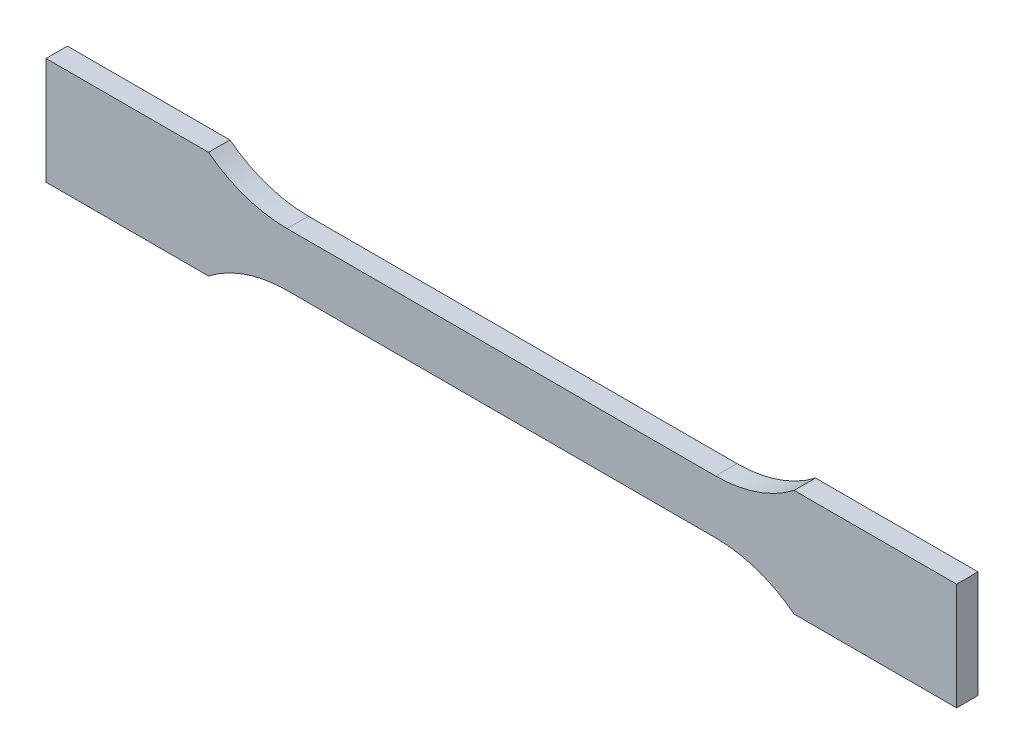
ISO-10303-21;
HEADER;
FILE_DESCRIPTION(('STEP AP214'),'2;1');
FILE_NAME('part.step','',(''),(''),'','','');
FILE_SCHEMA(('AUTOMOTIVE_DESIGN { 1 0 10303 214 1 1 1 1 }'));
ENDSEC;
DATA;
#1=APPLICATION_CONTEXT('core data for automotive mechanical design processes');
#2=APPLICATION_PROTOCOL_DEFINITION('international standard','automotive_design',2000,#1);
#3=PRODUCT_CONTEXT('',#1,'mechanical');
#4=PRODUCT('Part','Part','',(#3));
#5=PRODUCT_RELATED_PRODUCT_CATEGORY('part','',(#4));
#6=PRODUCT_DEFINITION_FORMATION('','',#4);
#7=PRODUCT_DEFINITION_CONTEXT('part definition',#1,'design');
#8=PRODUCT_DEFINITION('design','',#6,#7);
#9=PRODUCT_DEFINITION_SHAPE('','',#8);
#10=(LENGTH_UNIT() NAMED_UNIT(*) SI_UNIT(.MILLI.,.METRE.));
#11=(NAMED_UNIT(*) PLANE_ANGLE_UNIT() SI_UNIT($,.RADIAN.));
#12=(NAMED_UNIT(*) SI_UNIT($,.STERADIAN.) SOLID_ANGLE_UNIT());
#13=UNCERTAINTY_MEASURE_WITH_UNIT(LENGTH_MEASURE(1.E-05),#10,'distance_accuracy_value','');
#14=(GEOMETRIC_REPRESENTATION_CONTEXT(3) GLOBAL_UNCERTAINTY_ASSIGNED_CONTEXT((#13)) GLOBAL_UNIT_ASSIGNED_CONTEXT((#10,
#11,#12)) REPRESENTATION_CONTEXT('',''));
#15=CARTESIAN_POINT('',(0.,0.,0.));
#16=DIRECTION('',(0.,0.,1.));
#17=DIRECTION('',(1.,0.,0.));
#18=AXIS2_PLACEMENT_3D('',#15,#16,#17);
#19=CARTESIAN_POINT('',(-85.,9.99999999999999,2.));
#20=DIRECTION('',(0.,-1.,0.));
#21=DIRECTION('',(0.,0.,-1.));
#22=AXIS2_PLACEMENT_3D('',#19,#20,#21);
#23=PLANE('',#22);
#24=DIRECTION('',(-1.,0.,0.));
#25=VECTOR('',#24,1.);
#26=CARTESIAN_POINT('',(-85.,9.99999999999999,-2.));
#27=LINE('',#26,#25);
#28=CARTESIAN_POINT('',(-54.6628782986152,9.99999999999999,-2.));
#29=VERTEX_POINT('',#28);
#30=CARTESIAN_POINT('',(-85.,9.99999999999999,-2.));
#31=VERTEX_POINT('',#30);
#32=EDGE_CURVE('E155',#29,#31,#27,.T.);
#33=ORIENTED_EDGE('',*,*,#32,.T.);
#34=DIRECTION('',(0.,0.,-1.));
#35=VECTOR('',#34,1.);
#36=CARTESIAN_POINT('',(-85.,9.99999999999999,2.));
#37=LINE('',#36,#35);
#38=CARTESIAN_POINT('',(-85.,9.99999999999999,2.));
#39=VERTEX_POINT('',#38);
#40=EDGE_CURVE('E11',#39,#31,#37,.T.);
#41=ORIENTED_EDGE('',*,*,#40,.F.);
#42=DIRECTION('',(-1.,0.,0.));
#43=VECTOR('',#42,1.);
#44=CARTESIAN_POINT('',(-85.,9.99999999999999,2.));
#45=LINE('',#44,#43);
#46=CARTESIAN_POINT('',(-54.6628782986152,9.99999999999999,2.));
#47=VERTEX_POINT('',#46);
#48=EDGE_CURVE('E177',#47,#39,#45,.T.);
#49=ORIENTED_EDGE('',*,*,#48,.F.);
#50=DIRECTION('',(0.,0.,-1.));
#51=VECTOR('',#50,1.);
#52=CARTESIAN_POINT('',(-54.6628782986152,9.99999999999999,2.));
#53=LINE('',#52,#51);
#54=EDGE_CURVE('E151',#47,#29,#53,.T.);
#55=ORIENTED_EDGE('',*,*,#54,.T.);
#56=EDGE_LOOP('',(#33,#41,#49,#55));
#57=FACE_BOUND('',#56,.T.);
#58=ADVANCED_FACE('F35',(#57),#23,.F.);
#59=CARTESIAN_POINT('',(-85.,9.99999999999999,2.));
#60=DIRECTION('',(1.,0.,0.));
#61=DIRECTION('',(0.,0.,-1.));
#62=AXIS2_PLACEMENT_3D('',#59,#60,#61);
#63=PLANE('',#62);
#64=DIRECTION('',(0.,-1.,0.));
#65=VECTOR('',#64,1.);
#66=CARTESIAN_POINT('',(-85.,9.99999999999999,-2.));
#67=LINE('',#66,#65);
#68=CARTESIAN_POINT('',(-85.,-10.,-2.));
#69=VERTEX_POINT('',#68);
#70=EDGE_CURVE('E158',#31,#69,#67,.T.);
#71=ORIENTED_EDGE('',*,*,#70,.T.);
#72=DIRECTION('',(0.,0.,-1.));
#73=VECTOR('',#72,1.);
#74=CARTESIAN_POINT('',(-85.,-10.,2.));
#75=LINE('',#74,#73);
#76=CARTESIAN_POINT('',(-85.,-10.,2.));
#77=VERTEX_POINT('',#76);
#78=EDGE_CURVE('E43',#77,#69,#75,.T.);
#79=ORIENTED_EDGE('',*,*,#78,.F.);
#80=DIRECTION('',(0.,-1.,0.));
#81=VECTOR('',#80,1.);
#82=CARTESIAN_POINT('',(-85.,9.99999999999999,2.));
#83=LINE('',#82,#81);
#84=EDGE_CURVE('E106',#39,#77,#83,.T.);
#85=ORIENTED_EDGE('',*,*,#84,.F.);
#86=ORIENTED_EDGE('',*,*,#40,.T.);
#87=EDGE_LOOP('',(#71,#79,#85,#86));
#88=FACE_BOUND('',#87,.T.);
#89=ADVANCED_FACE('F255',(#88),#63,.F.);
#90=CARTESIAN_POINT('',(-85.,-10.,2.));
#91=DIRECTION('',(0.,1.,0.));
#92=DIRECTION('',(-1.,0.,0.));
#93=AXIS2_PLACEMENT_3D('',#90,#91,#92);
#94=PLANE('',#93);
#95=DIRECTION('',(1.,0.,0.));
#96=VECTOR('',#95,1.);
#97=CARTESIAN_POINT('',(-85.,-10.,-2.));
#98=LINE('',#97,#96);
#99=CARTESIAN_POINT('',(-54.6628782986152,-10.,-2.));
#100=VERTEX_POINT('',#99);
#101=EDGE_CURVE('E160',#69,#100,#98,.T.);
#102=ORIENTED_EDGE('',*,*,#101,.T.);
#103=DIRECTION('',(0.,0.,-1.));
#104=VECTOR('',#103,1.);
#105=CARTESIAN_POINT('',(-54.6628782986152,-10.,2.));
#106=LINE('',#105,#104);
#107=CARTESIAN_POINT('',(-54.6628782986152,-10.,2.));
#108=VERTEX_POINT('',#107);
#109=EDGE_CURVE('E196',#108,#100,#106,.T.);
#110=ORIENTED_EDGE('',*,*,#109,.F.);
#111=DIRECTION('',(1.,0.,0.));
#112=VECTOR('',#111,1.);
#113=CARTESIAN_POINT('',(-85.,-10.,2.));
#114=LINE('',#113,#112);
#115=EDGE_CURVE('E204',#77,#108,#114,.T.);
#116=ORIENTED_EDGE('',*,*,#115,.F.);
#117=ORIENTED_EDGE('',*,*,#78,.T.);
#118=EDGE_LOOP('',(#102,#110,#116,#117));
#119=FACE_BOUND('',#118,.T.);
#120=ADVANCED_FACE('F202',(#119),#94,.F.);
#121=CARTESIAN_POINT('',(-40.,-28.9999999999998,2.));
#122=DIRECTION('',(0.,0.,-1.));
#123=DIRECTION('',(-1.,0.,0.));
#124=AXIS2_PLACEMENT_3D('',#121,#122,#123);
#125=CYLINDRICAL_SURFACE('',#124,23.9999999999998);
#126=CARTESIAN_POINT('',(-40.,-28.9999999999998,-2.));
#127=DIRECTION('',(0.,0.,-1.));
#128=DIRECTION('',(1.,0.,0.));
#129=AXIS2_PLACEMENT_3D('',#126,#127,#128);
#130=CIRCLE('',#129,23.9999999999998);
#131=CARTESIAN_POINT('',(-40.,-4.99999999999999,-2.));
#132=VERTEX_POINT('',#131);
#133=EDGE_CURVE('E162',#100,#132,#130,.T.);
#134=ORIENTED_EDGE('',*,*,#133,.T.);
#135=DIRECTION('',(0.,0.,-1.));
#136=VECTOR('',#135,1.);
#137=CARTESIAN_POINT('',(-40.,-4.99999999999999,2.));
#138=LINE('',#137,#136);
#139=CARTESIAN_POINT('',(-40.,-4.99999999999999,2.));
#140=VERTEX_POINT('',#139);
#141=EDGE_CURVE('E193',#140,#132,#138,.T.);
#142=ORIENTED_EDGE('',*,*,#141,.F.);
#143=CARTESIAN_POINT('',(-40.,-28.9999999999998,2.));
#144=DIRECTION('',(0.,0.,-1.));
#145=DIRECTION('',(1.,0.,0.));
#146=AXIS2_PLACEMENT_3D('',#143,#144,#145);
#147=CIRCLE('',#146,23.9999999999998);
#148=EDGE_CURVE('E222',#108,#140,#147,.T.);
#149=ORIENTED_EDGE('',*,*,#148,.F.);
#150=ORIENTED_EDGE('',*,*,#109,.T.);
#151=EDGE_LOOP('',(#134,#142,#149,#150));
#152=FACE_BOUND('',#151,.T.);
#153=ADVANCED_FACE('F213',(#152),#125,.F.);
#154=CARTESIAN_POINT('',(-40.,-4.99999999999999,2.));
#155=DIRECTION('',(0.,1.,0.));
#156=DIRECTION('',(-1.,0.,0.));
#157=AXIS2_PLACEMENT_3D('',#154,#155,#156);
#158=PLANE('',#157);
#159=DIRECTION('',(1.,0.,0.));
#160=VECTOR('',#159,1.);
#161=CARTESIAN_POINT('',(-40.,-4.99999999999999,-2.));
#162=LINE('',#161,#160);
#163=CARTESIAN_POINT('',(40.,-4.99999999999999,-2.));
#164=VERTEX_POINT('',#163);
#165=EDGE_CURVE('E164',#132,#164,#162,.T.);
#166=ORIENTED_EDGE('',*,*,#165,.T.);
#167=DIRECTION('',(0.,0.,-1.));
#168=VECTOR('',#167,1.);
#169=CARTESIAN_POINT('',(40.,-4.99999999999999,2.));
#170=LINE('',#169,#168);
#171=CARTESIAN_POINT('',(40.,-4.99999999999999,2.));
#172=VERTEX_POINT('',#171);
#173=EDGE_CURVE('E190',#172,#164,#170,.T.);
#174=ORIENTED_EDGE('',*,*,#173,.F.);
#175=DIRECTION('',(1.,0.,0.));
#176=VECTOR('',#175,1.);
#177=CARTESIAN_POINT('',(-40.,-4.99999999999999,2.));
#178=LINE('',#177,#176);
#179=EDGE_CURVE('E219',#140,#172,#178,.T.);
#180=ORIENTED_EDGE('',*,*,#179,.F.);
#181=ORIENTED_EDGE('',*,*,#141,.T.);
#182=EDGE_LOOP('',(#166,#174,#180,#181));
#183=FACE_BOUND('',#182,.T.);
#184=ADVANCED_FACE('F217',(#183),#158,.F.);
#185=CARTESIAN_POINT('',(40.,-28.9999999999999,2.));
#186=DIRECTION('',(0.,0.,-1.));
#187=DIRECTION('',(-1.,0.,0.));
#188=AXIS2_PLACEMENT_3D('',#185,#186,#187);
#189=CYLINDRICAL_SURFACE('',#188,23.9999999999999);
#190=CARTESIAN_POINT('',(40.,-28.9999999999999,-2.));
#191=DIRECTION('',(0.,0.,-1.));
#192=DIRECTION('',(-1.,0.,0.));
#193=AXIS2_PLACEMENT_3D('',#190,#191,#192);
#194=CIRCLE('',#193,23.9999999999999);
#195=CARTESIAN_POINT('',(54.6628782986152,-10.,-2.));
#196=VERTEX_POINT('',#195);
#197=EDGE_CURVE('E166',#164,#196,#194,.T.);
#198=ORIENTED_EDGE('',*,*,#197,.T.);
#199=DIRECTION('',(0.,0.,-1.));
#200=VECTOR('',#199,1.);
#201=CARTESIAN_POINT('',(54.6628782986152,-10.,2.));
#202=LINE('',#201,#200);
#203=CARTESIAN_POINT('',(54.6628782986152,-10.,2.));
#204=VERTEX_POINT('',#203);
#205=EDGE_CURVE('E187',#204,#196,#202,.T.);
#206=ORIENTED_EDGE('',*,*,#205,.F.);
#207=CARTESIAN_POINT('',(40.,-28.9999999999999,2.));
#208=DIRECTION('',(0.,0.,-1.));
#209=DIRECTION('',(-1.,0.,0.));
#210=AXIS2_PLACEMENT_3D('',#207,#208,#209);
#211=CIRCLE('',#210,23.9999999999999);
#212=EDGE_CURVE('E221',#172,#204,#211,.T.);
#213=ORIENTED_EDGE('',*,*,#212,.F.);
#214=ORIENTED_EDGE('',*,*,#173,.T.);
#215=EDGE_LOOP('',(#198,#206,#213,#214));
#216=FACE_BOUND('',#215,.T.);
#217=ADVANCED_FACE('F268',(#216),#189,.F.);
#218=CARTESIAN_POINT('',(85.,-10.,2.));
#219=DIRECTION('',(0.,1.,0.));
#220=DIRECTION('',(-1.,0.,0.));
#221=AXIS2_PLACEMENT_3D('',#218,#219,#220);
#222=PLANE('',#221);
#223=DIRECTION('',(1.,0.,0.));
#224=VECTOR('',#223,1.);
#225=CARTESIAN_POINT('',(85.,-10.,-2.));
#226=LINE('',#225,#224);
#227=CARTESIAN_POINT('',(85.,-10.,-2.));
#228=VERTEX_POINT('',#227);
#229=EDGE_CURVE('E168',#196,#228,#226,.T.);
#230=ORIENTED_EDGE('',*,*,#229,.T.);
#231=DIRECTION('',(0.,0.,-1.));
#232=VECTOR('',#231,1.);
#233=CARTESIAN_POINT('',(85.,-10.,2.));
#234=LINE('',#233,#232);
#235=CARTESIAN_POINT('',(85.,-10.,2.));
#236=VERTEX_POINT('',#235);
#237=EDGE_CURVE('E184',#236,#228,#234,.T.);
#238=ORIENTED_EDGE('',*,*,#237,.F.);
#239=DIRECTION('',(1.,0.,0.));
#240=VECTOR('',#239,1.);
#241=CARTESIAN_POINT('',(85.,-10.,2.));
#242=LINE('',#241,#240);
#243=EDGE_CURVE('E224',#204,#236,#242,.T.);
#244=ORIENTED_EDGE('',*,*,#243,.F.);
#245=ORIENTED_EDGE('',*,*,#205,.T.);
#246=EDGE_LOOP('',(#230,#238,#244,#245));
#247=FACE_BOUND('',#246,.T.);
#248=ADVANCED_FACE('F271',(#247),#222,.F.);
#249=CARTESIAN_POINT('',(85.,9.99999999999999,2.));
#250=DIRECTION('',(-1.,0.,0.));
#251=DIRECTION('',(0.,-1.,0.));
#252=AXIS2_PLACEMENT_3D('',#249,#250,#251);
#253=PLANE('',#252);
#254=DIRECTION('',(0.,1.,0.));
#255=VECTOR('',#254,1.);
#256=CARTESIAN_POINT('',(85.,9.99999999999999,-2.));
#257=LINE('',#256,#255);
#258=CARTESIAN_POINT('',(85.,9.99999999999999,-2.));
#259=VERTEX_POINT('',#258);
#260=EDGE_CURVE('E170',#228,#259,#257,.T.);
#261=ORIENTED_EDGE('',*,*,#260,.T.);
#262=DIRECTION('',(0.,0.,-1.));
#263=VECTOR('',#262,1.);
#264=CARTESIAN_POINT('',(85.,9.99999999999999,2.));
#265=LINE('',#264,#263);
#266=CARTESIAN_POINT('',(85.,9.99999999999999,2.));
#267=VERTEX_POINT('',#266);
#268=EDGE_CURVE('E181',#267,#259,#265,.T.);
#269=ORIENTED_EDGE('',*,*,#268,.F.);
#270=DIRECTION('',(0.,1.,0.));
#271=VECTOR('',#270,1.);
#272=CARTESIAN_POINT('',(85.,9.99999999999999,2.));
#273=LINE('',#272,#271);
#274=EDGE_CURVE('E230',#236,#267,#273,.T.);
#275=ORIENTED_EDGE('',*,*,#274,.F.);
#276=ORIENTED_EDGE('',*,*,#237,.T.);
#277=EDGE_LOOP('',(#261,#269,#275,#276));
#278=FACE_BOUND('',#277,.T.);
#279=ADVANCED_FACE('F236',(#278),#253,.F.);
#280=CARTESIAN_POINT('',(54.6628782986152,9.99999999999999,2.));
#281=DIRECTION('',(0.,-1.,0.));
#282=DIRECTION('',(0.,0.,-1.));
#283=AXIS2_PLACEMENT_3D('',#280,#281,#282);
#284=PLANE('',#283);
#285=DIRECTION('',(-1.,0.,0.));
#286=VECTOR('',#285,1.);
#287=CARTESIAN_POINT('',(54.6628782986152,9.99999999999999,-2.));
#288=LINE('',#287,#286);
#289=CARTESIAN_POINT('',(54.6628782986152,9.99999999999999,-2.));
#290=VERTEX_POINT('',#289);
#291=EDGE_CURVE('E172',#259,#290,#288,.T.);
#292=ORIENTED_EDGE('',*,*,#291,.T.);
#293=DIRECTION('',(0.,0.,-1.));
#294=VECTOR('',#293,1.);
#295=CARTESIAN_POINT('',(54.6628782986152,9.99999999999999,2.));
#296=LINE('',#295,#294);
#297=CARTESIAN_POINT('',(54.6628782986152,9.99999999999999,2.));
#298=VERTEX_POINT('',#297);
#299=EDGE_CURVE('E146',#298,#290,#296,.T.);
#300=ORIENTED_EDGE('',*,*,#299,.F.);
#301=DIRECTION('',(-1.,0.,0.));
#302=VECTOR('',#301,1.);
#303=CARTESIAN_POINT('',(54.6628782986152,9.99999999999999,2.));
#304=LINE('',#303,#302);
#305=EDGE_CURVE('E137',#267,#298,#304,.T.);
#306=ORIENTED_EDGE('',*,*,#305,.F.);
#307=ORIENTED_EDGE('',*,*,#268,.T.);
#308=EDGE_LOOP('',(#292,#300,#306,#307));
#309=FACE_BOUND('',#308,.T.);
#310=ADVANCED_FACE('F240',(#309),#284,.F.);
#311=CARTESIAN_POINT('',(40.,29.,2.));
#312=DIRECTION('',(0.,0.,-1.));
#313=DIRECTION('',(-1.,0.,0.));
#314=AXIS2_PLACEMENT_3D('',#311,#312,#313);
#315=CYLINDRICAL_SURFACE('',#314,24.);
#316=CARTESIAN_POINT('',(40.,29.,-2.));
#317=DIRECTION('',(0.,0.,-1.));
#318=DIRECTION('',(1.,0.,0.));
#319=AXIS2_PLACEMENT_3D('',#316,#317,#318);
#320=CIRCLE('',#319,24.);
#321=CARTESIAN_POINT('',(40.,4.99999999999999,-2.));
#322=VERTEX_POINT('',#321);
#323=EDGE_CURVE('E145',#290,#322,#320,.T.);
#324=ORIENTED_EDGE('',*,*,#323,.T.);
#325=DIRECTION('',(0.,0.,-1.));
#326=VECTOR('',#325,1.);
#327=CARTESIAN_POINT('',(40.,4.99999999999999,2.));
#328=LINE('',#327,#326);
#329=CARTESIAN_POINT('',(40.,4.99999999999999,2.));
#330=VERTEX_POINT('',#329);
#331=EDGE_CURVE('E142',#330,#322,#328,.T.);
#332=ORIENTED_EDGE('',*,*,#331,.F.);
#333=CARTESIAN_POINT('',(40.,29.,2.));
#334=DIRECTION('',(0.,0.,-1.));
#335=DIRECTION('',(1.,0.,0.));
#336=AXIS2_PLACEMENT_3D('',#333,#334,#335);
#337=CIRCLE('',#336,24.);
#338=EDGE_CURVE('E131',#298,#330,#337,.T.);
#339=ORIENTED_EDGE('',*,*,#338,.F.);
#340=ORIENTED_EDGE('',*,*,#299,.T.);
#341=EDGE_LOOP('',(#324,#332,#339,#340));
#342=FACE_BOUND('',#341,.T.);
#343=ADVANCED_FACE('F143',(#342),#315,.F.);
#344=CARTESIAN_POINT('',(-40.,5.00000000000001,2.));
#345=DIRECTION('',(0.,-1.,0.));
#346=DIRECTION('',(0.,0.,-1.));
#347=AXIS2_PLACEMENT_3D('',#344,#345,#346);
#348=PLANE('',#347);
#349=DIRECTION('',(-1.,0.,0.));
#350=VECTOR('',#349,1.);
#351=CARTESIAN_POINT('',(-40.,5.00000000000001,-2.));
#352=LINE('',#351,#350);
#353=CARTESIAN_POINT('',(-40.,5.00000000000001,-2.));
#354=VERTEX_POINT('',#353);
#355=EDGE_CURVE('E92',#322,#354,#352,.T.);
#356=ORIENTED_EDGE('',*,*,#355,.T.);
#357=DIRECTION('',(0.,0.,-1.));
#358=VECTOR('',#357,1.);
#359=CARTESIAN_POINT('',(-40.,5.00000000000001,2.));
#360=LINE('',#359,#358);
#361=CARTESIAN_POINT('',(-40.,5.00000000000001,2.));
#362=VERTEX_POINT('',#361);
#363=EDGE_CURVE('E147',#362,#354,#360,.T.);
#364=ORIENTED_EDGE('',*,*,#363,.F.);
#365=DIRECTION('',(-1.,0.,0.));
#366=VECTOR('',#365,1.);
#367=CARTESIAN_POINT('',(-40.,5.00000000000001,2.));
#368=LINE('',#367,#366);
#369=EDGE_CURVE('E135',#330,#362,#368,.T.);
#370=ORIENTED_EDGE('',*,*,#369,.F.);
#371=ORIENTED_EDGE('',*,*,#331,.T.);
#372=EDGE_LOOP('',(#356,#364,#370,#371));
#373=FACE_BOUND('',#372,.T.);
#374=ADVANCED_FACE('F149',(#373),#348,.F.);
#375=CARTESIAN_POINT('',(-40.,29.,2.));
#376=DIRECTION('',(0.,0.,-1.));
#377=DIRECTION('',(-1.,0.,0.));
#378=AXIS2_PLACEMENT_3D('',#375,#376,#377);
#379=CYLINDRICAL_SURFACE('',#378,24.);
#380=CARTESIAN_POINT('',(-40.,29.,-2.));
#381=DIRECTION('',(0.,0.,-1.));
#382=DIRECTION('',(-1.,0.,0.));
#383=AXIS2_PLACEMENT_3D('',#380,#381,#382);
#384=CIRCLE('',#383,24.);
#385=EDGE_CURVE('E98',#354,#29,#384,.T.);
#386=ORIENTED_EDGE('',*,*,#385,.T.);
#387=ORIENTED_EDGE('',*,*,#54,.F.);
#388=CARTESIAN_POINT('',(-40.,29.,2.));
#389=DIRECTION('',(0.,0.,-1.));
#390=DIRECTION('',(-1.,0.,0.));
#391=AXIS2_PLACEMENT_3D('',#388,#389,#390);
#392=CIRCLE('',#391,24.);
#393=EDGE_CURVE('E51',#362,#47,#392,.T.);
#394=ORIENTED_EDGE('',*,*,#393,.F.);
#395=ORIENTED_EDGE('',*,*,#363,.T.);
#396=EDGE_LOOP('',(#386,#387,#394,#395));
#397=FACE_BOUND('',#396,.T.);
#398=ADVANCED_FACE('F244',(#397),#379,.F.);
#399=CARTESIAN_POINT('',(-40.,29.,2.));
#400=DIRECTION('',(0.,0.,-1.));
#401=DIRECTION('',(-1.,0.,0.));
#402=AXIS2_PLACEMENT_3D('',#399,#400,#401);
#403=PLANE('',#402);
#404=ORIENTED_EDGE('',*,*,#48,.T.);
#405=ORIENTED_EDGE('',*,*,#84,.T.);
#406=ORIENTED_EDGE('',*,*,#115,.T.);
#407=ORIENTED_EDGE('',*,*,#148,.T.);
#408=ORIENTED_EDGE('',*,*,#179,.T.);
#409=ORIENTED_EDGE('',*,*,#212,.T.);
#410=ORIENTED_EDGE('',*,*,#243,.T.);
#411=ORIENTED_EDGE('',*,*,#274,.T.);
#412=ORIENTED_EDGE('',*,*,#305,.T.);
#413=ORIENTED_EDGE('',*,*,#338,.T.);
#414=ORIENTED_EDGE('',*,*,#369,.T.);
#415=ORIENTED_EDGE('',*,*,#393,.T.);
#416=EDGE_LOOP('',(#404,#405,#406,#407,#408,#409,#410,#411,#412,#413,#414,#415));
#417=FACE_BOUND('',#416,.T.);
#418=ADVANCED_FACE('F133',(#417),#403,.F.);
#419=CARTESIAN_POINT('',(-40.,29.,-2.));
#420=DIRECTION('',(0.,0.,-1.));
#421=DIRECTION('',(-1.,0.,0.));
#422=AXIS2_PLACEMENT_3D('',#419,#420,#421);
#423=PLANE('',#422);
#424=ORIENTED_EDGE('',*,*,#32,.F.);
#425=ORIENTED_EDGE('',*,*,#385,.F.);
#426=ORIENTED_EDGE('',*,*,#355,.F.);
#427=ORIENTED_EDGE('',*,*,#323,.F.);
#428=ORIENTED_EDGE('',*,*,#291,.F.);
#429=ORIENTED_EDGE('',*,*,#260,.F.);
#430=ORIENTED_EDGE('',*,*,#229,.F.);
#431=ORIENTED_EDGE('',*,*,#197,.F.);
#432=ORIENTED_EDGE('',*,*,#165,.F.);
#433=ORIENTED_EDGE('',*,*,#133,.F.);
#434=ORIENTED_EDGE('',*,*,#101,.F.);
#435=ORIENTED_EDGE('',*,*,#70,.F.);
#436=EDGE_LOOP('',(#424,#425,#426,#427,#428,#429,#430,#431,#432,#433,#434,#435));
#437=FACE_BOUND('',#436,.T.);
#438=ADVANCED_FACE('F208',(#437),#423,.T.);
#439=CLOSED_SHELL('',(#58,#89,#120,#153,#184,#217,#248,#279,#310,#343,#374,#398,#418,#438));
#440=MANIFOLD_SOLID_BREP('B2',#439);
#441=ADVANCED_BREP_SHAPE_REPRESENTATION('',(#18,#440),#14);
#442=SHAPE_DEFINITION_REPRESENTATION(#9,#441);
ENDSEC;
END-ISO-10303-21;
